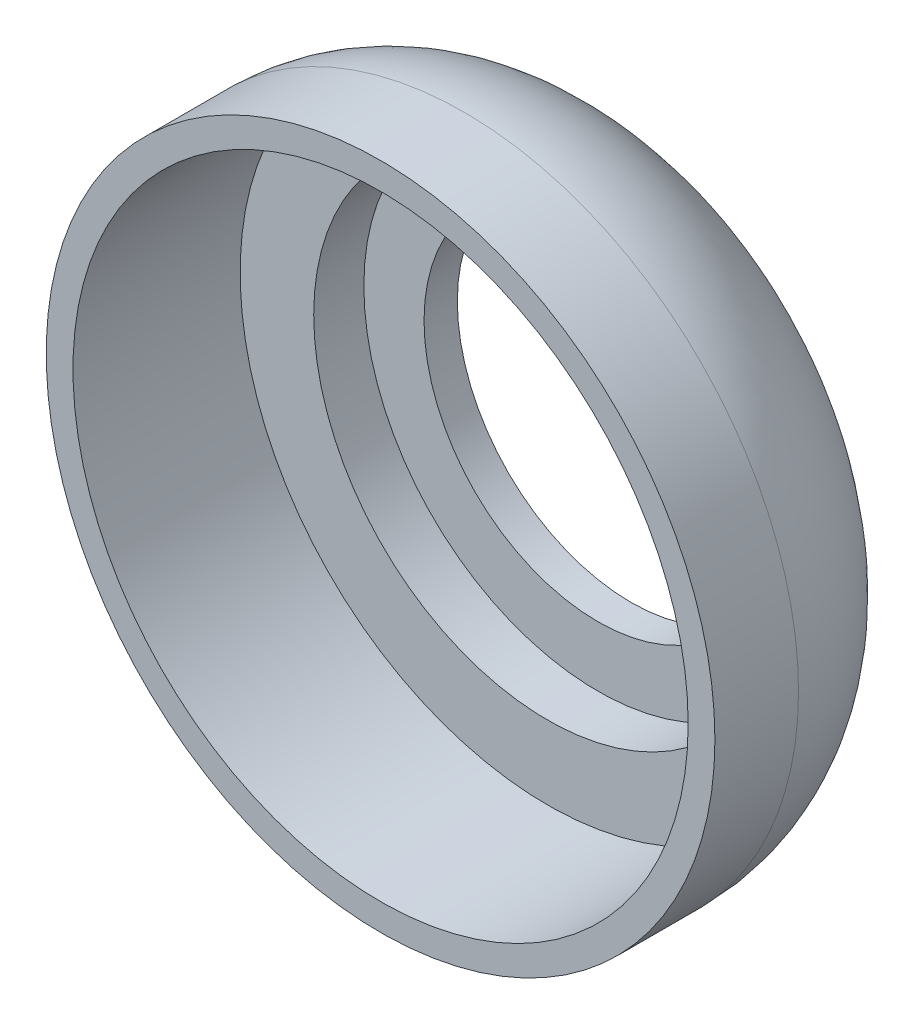
ISO-10303-21;
HEADER;
FILE_DESCRIPTION(('STEP AP214'),'2;1');
FILE_NAME('part.step','',(''),(''),'','','');
FILE_SCHEMA(('AUTOMOTIVE_DESIGN { 1 0 10303 214 1 1 1 1 }'));
ENDSEC;
DATA;
#1=APPLICATION_CONTEXT('core data for automotive mechanical design processes');
#2=APPLICATION_PROTOCOL_DEFINITION('international standard','automotive_design',2000,#1);
#3=PRODUCT_CONTEXT('',#1,'mechanical');
#4=PRODUCT('Part','Part','',(#3));
#5=PRODUCT_RELATED_PRODUCT_CATEGORY('part','',(#4));
#6=PRODUCT_DEFINITION_FORMATION('','',#4);
#7=PRODUCT_DEFINITION_CONTEXT('part definition',#1,'design');
#8=PRODUCT_DEFINITION('design','',#6,#7);
#9=PRODUCT_DEFINITION_SHAPE('','',#8);
#10=(LENGTH_UNIT() NAMED_UNIT(*) SI_UNIT(.MILLI.,.METRE.));
#11=(NAMED_UNIT(*) PLANE_ANGLE_UNIT() SI_UNIT($,.RADIAN.));
#12=(NAMED_UNIT(*) SI_UNIT($,.STERADIAN.) SOLID_ANGLE_UNIT());
#13=UNCERTAINTY_MEASURE_WITH_UNIT(LENGTH_MEASURE(1.E-05),#10,'distance_accuracy_value','');
#14=(GEOMETRIC_REPRESENTATION_CONTEXT(3) GLOBAL_UNCERTAINTY_ASSIGNED_CONTEXT((#13)) GLOBAL_UNIT_ASSIGNED_CONTEXT((#10,
#11,#12)) REPRESENTATION_CONTEXT('',''));
#15=CARTESIAN_POINT('',(0.,0.,0.));
#16=DIRECTION('',(0.,0.,1.));
#17=DIRECTION('',(1.,0.,0.));
#18=AXIS2_PLACEMENT_3D('',#15,#16,#17);
#19=CARTESIAN_POINT('',(0.,0.,2.));
#20=DIRECTION('',(0.,0.,1.));
#21=DIRECTION('',(1.,0.,0.));
#22=AXIS2_PLACEMENT_3D('',#19,#20,#21);
#23=CYLINDRICAL_SURFACE('',#22,14.);
#24=CARTESIAN_POINT('',(0.,0.,2.));
#25=DIRECTION('',(0.,0.,1.));
#26=DIRECTION('',(1.,0.,0.));
#27=AXIS2_PLACEMENT_3D('',#24,#25,#26);
#28=CIRCLE('',#27,14.);
#29=CARTESIAN_POINT('',(14.,0.,2.));
#30=VERTEX_POINT('',#29);
#31=EDGE_CURVE('E52',#30,#30,#28,.T.);
#32=CARTESIAN_POINT('',(0.,0.,5.));
#33=DIRECTION('',(0.,0.,1.));
#34=DIRECTION('',(1.,0.,0.));
#35=AXIS2_PLACEMENT_3D('',#32,#33,#34);
#36=CIRCLE('',#35,14.);
#37=CARTESIAN_POINT('',(14.,0.,5.));
#38=VERTEX_POINT('',#37);
#39=EDGE_CURVE('E41',#38,#38,#36,.F.);
#40=CARTESIAN_POINT('',(14.,0.,2.));
#41=CARTESIAN_POINT('',(14.,0.,2.03125));
#42=CARTESIAN_POINT('',(14.,0.,2.0625));
#43=CARTESIAN_POINT('',(14.,0.,2.125));
#44=CARTESIAN_POINT('',(14.,0.,2.15625));
#45=CARTESIAN_POINT('',(14.,0.,2.21875));
#46=CARTESIAN_POINT('',(14.,0.,2.25));
#47=CARTESIAN_POINT('',(14.,0.,2.3125));
#48=CARTESIAN_POINT('',(14.,0.,2.34375));
#49=CARTESIAN_POINT('',(14.,0.,2.40625));
#50=CARTESIAN_POINT('',(14.,0.,2.4375));
#51=CARTESIAN_POINT('',(14.,0.,2.5));
#52=CARTESIAN_POINT('',(14.,0.,2.53125));
#53=CARTESIAN_POINT('',(14.,0.,2.59375));
#54=CARTESIAN_POINT('',(14.,0.,2.625));
#55=CARTESIAN_POINT('',(14.,0.,2.6875));
#56=CARTESIAN_POINT('',(14.,0.,2.71875));
#57=CARTESIAN_POINT('',(14.,0.,2.78125));
#58=CARTESIAN_POINT('',(14.,0.,2.8125));
#59=CARTESIAN_POINT('',(14.,0.,2.875));
#60=CARTESIAN_POINT('',(14.,0.,2.90625));
#61=CARTESIAN_POINT('',(14.,0.,2.96875));
#62=CARTESIAN_POINT('',(14.,0.,3.));
#63=CARTESIAN_POINT('',(14.,0.,3.0625));
#64=CARTESIAN_POINT('',(14.,0.,3.09375));
#65=CARTESIAN_POINT('',(14.,0.,3.15625));
#66=CARTESIAN_POINT('',(14.,0.,3.1875));
#67=CARTESIAN_POINT('',(14.,0.,3.25));
#68=CARTESIAN_POINT('',(14.,0.,3.28125));
#69=CARTESIAN_POINT('',(14.,0.,3.34375));
#70=CARTESIAN_POINT('',(14.,0.,3.375));
#71=CARTESIAN_POINT('',(14.,0.,3.4375));
#72=CARTESIAN_POINT('',(14.,0.,3.46875));
#73=CARTESIAN_POINT('',(14.,0.,3.53125));
#74=CARTESIAN_POINT('',(14.,0.,3.5625));
#75=CARTESIAN_POINT('',(14.,0.,3.625));
#76=CARTESIAN_POINT('',(14.,0.,3.65625));
#77=CARTESIAN_POINT('',(14.,0.,3.71875));
#78=CARTESIAN_POINT('',(14.,0.,3.75));
#79=CARTESIAN_POINT('',(14.,0.,3.8125));
#80=CARTESIAN_POINT('',(14.,0.,3.84375));
#81=CARTESIAN_POINT('',(14.,0.,3.90625));
#82=CARTESIAN_POINT('',(14.,0.,3.9375));
#83=CARTESIAN_POINT('',(14.,0.,4.));
#84=CARTESIAN_POINT('',(14.,0.,4.03125));
#85=CARTESIAN_POINT('',(14.,0.,4.09375));
#86=CARTESIAN_POINT('',(14.,0.,4.125));
#87=CARTESIAN_POINT('',(14.,0.,4.1875));
#88=CARTESIAN_POINT('',(14.,0.,4.21875));
#89=CARTESIAN_POINT('',(14.,0.,4.28125));
#90=CARTESIAN_POINT('',(14.,0.,4.3125));
#91=CARTESIAN_POINT('',(14.,0.,4.375));
#92=CARTESIAN_POINT('',(14.,0.,4.40625));
#93=CARTESIAN_POINT('',(14.,0.,4.46875));
#94=CARTESIAN_POINT('',(14.,0.,4.5));
#95=CARTESIAN_POINT('',(14.,0.,4.5625));
#96=CARTESIAN_POINT('',(14.,0.,4.59375));
#97=CARTESIAN_POINT('',(14.,0.,4.65625));
#98=CARTESIAN_POINT('',(14.,0.,4.6875));
#99=CARTESIAN_POINT('',(14.,0.,4.75));
#100=CARTESIAN_POINT('',(14.,0.,4.78125));
#101=CARTESIAN_POINT('',(14.,0.,4.84375));
#102=CARTESIAN_POINT('',(14.,0.,4.875));
#103=CARTESIAN_POINT('',(14.,0.,4.9375));
#104=CARTESIAN_POINT('',(14.,0.,4.96875));
#105=CARTESIAN_POINT('',(14.,0.,5.));
#106=B_SPLINE_CURVE_WITH_KNOTS('',3,(#40,#41,#42,#43,#44,#45,#46,#47,#48,#49,#50,#51,#52,#53,
#54,#55,#56,#57,#58,#59,#60,#61,#62,#63,#64,#65,#66,#67,#68,#69,#70,#71,#72,#73,#74,#75,#76,#77,
#78,#79,#80,#81,#82,#83,#84,#85,#86,#87,#88,#89,#90,#91,#92,#93,#94,#95,#96,#97,#98,#99,#100,
#101,#102,#103,#104,#105),.UNSPECIFIED.,.F.,.F.,(4,2,2,2,2,2,2,2,2,2,2,2,2,2,2,2,2,2,2,2,2,2,2,
2,2,2,2,2,2,2,2,2,4),(0.,0.0937500000000001,0.1875,0.28125,0.375,0.46875,0.5625,0.65625,0.75,
0.84375,0.9375,1.03125,1.125,1.21875,1.3125,1.40625,1.5,1.59375,1.6875,1.78125,1.875,1.96875,
2.0625,2.15625,2.25,2.34375,2.4375,2.53125,2.625,2.71875,2.8125,2.90625,3.),.UNSPECIFIED.);
#107=EDGE_CURVE('BSEAM37',#30,#38,#106,.T.);
#108=ORIENTED_EDGE('',*,*,#31,.F.);
#109=ORIENTED_EDGE('',*,*,#39,.F.);
#110=ORIENTED_EDGE('',*,*,#107,.T.);
#111=ORIENTED_EDGE('',*,*,#107,.F.);
#112=EDGE_LOOP('',(#108,#110,#109,#111));
#113=FACE_BOUND('',#112,.T.);
#114=ADVANCED_FACE('F37',(#113),#23,.F.);
#115=CARTESIAN_POINT('',(0.,0.,15.));
#116=DIRECTION('',(0.,0.,-1.));
#117=DIRECTION('',(-1.,0.,0.));
#118=AXIS2_PLACEMENT_3D('',#115,#116,#117);
#119=CYLINDRICAL_SURFACE('',#118,20.);
#120=CARTESIAN_POINT('',(0.,0.,10.));
#121=DIRECTION('',(0.,0.,1.));
#122=DIRECTION('',(1.,0.,0.));
#123=AXIS2_PLACEMENT_3D('',#120,#121,#122);
#124=CIRCLE('',#123,20.);
#125=CARTESIAN_POINT('',(20.,0.,10.));
#126=VERTEX_POINT('',#125);
#127=EDGE_CURVE('E10',#126,#126,#124,.T.);
#128=ORIENTED_EDGE('',*,*,#127,.T.);
#129=EDGE_LOOP('',(#128));
#130=FACE_BOUND('',#129,.T.);
#131=CARTESIAN_POINT('',(0.,0.,15.));
#132=DIRECTION('',(0.,0.,1.));
#133=DIRECTION('',(1.,0.,0.));
#134=AXIS2_PLACEMENT_3D('',#131,#132,#133);
#135=CIRCLE('',#134,20.);
#136=CARTESIAN_POINT('',(20.,0.,15.));
#137=VERTEX_POINT('',#136);
#138=EDGE_CURVE('E46',#137,#137,#135,.T.);
#139=ORIENTED_EDGE('',*,*,#138,.F.);
#140=EDGE_LOOP('',(#139));
#141=FACE_BOUND('',#140,.T.);
#142=ADVANCED_FACE('F86',(#130,#141),#119,.T.);
#143=CARTESIAN_POINT('',(0.,0.,15.));
#144=DIRECTION('',(0.,0.,1.));
#145=DIRECTION('',(1.,0.,0.));
#146=AXIS2_PLACEMENT_3D('',#143,#144,#145);
#147=PLANE('',#146);
#148=CARTESIAN_POINT('',(0.,0.,15.));
#149=DIRECTION('',(0.,0.,1.));
#150=DIRECTION('',(1.,0.,0.));
#151=AXIS2_PLACEMENT_3D('',#148,#149,#150);
#152=CIRCLE('',#151,18.4);
#153=CARTESIAN_POINT('',(18.4,0.,15.));
#154=VERTEX_POINT('',#153);
#155=EDGE_CURVE('E71',#154,#154,#152,.T.);
#156=ORIENTED_EDGE('',*,*,#155,.F.);
#157=EDGE_LOOP('',(#156));
#158=FACE_BOUND('',#157,.T.);
#159=ORIENTED_EDGE('',*,*,#138,.T.);
#160=EDGE_LOOP('',(#159));
#161=FACE_BOUND('',#160,.T.);
#162=ADVANCED_FACE('F91',(#158,#161),#147,.T.);
#163=CARTESIAN_POINT('',(0.,0.,10.));
#164=DIRECTION('',(0.,0.,1.));
#165=DIRECTION('',(1.,0.,0.));
#166=AXIS2_PLACEMENT_3D('',#163,#164,#165);
#167=DEGENERATE_TOROIDAL_SURFACE('',#166,10.,10.,.T.);
#168=CARTESIAN_POINT('',(0.,0.,0.00800320256256343));
#169=DIRECTION('',(0.,0.,1.));
#170=DIRECTION('',(1.,0.,0.));
#171=AXIS2_PLACEMENT_3D('',#168,#169,#170);
#172=CIRCLE('',#171,10.4);
#173=CARTESIAN_POINT('',(10.4,0.,0.00800320256256343));
#174=VERTEX_POINT('',#173);
#175=EDGE_CURVE('E58',#174,#174,#172,.F.);
#176=ORIENTED_EDGE('',*,*,#175,.F.);
#177=EDGE_LOOP('',(#176));
#178=FACE_BOUND('',#177,.T.);
#179=ORIENTED_EDGE('',*,*,#127,.F.);
#180=EDGE_LOOP('',(#179));
#181=FACE_BOUND('',#180,.T.);
#182=ADVANCED_FACE('F39',(#178,#181),#167,.T.);
#183=CARTESIAN_POINT('',(0.,0.,2.));
#184=DIRECTION('',(0.,0.,1.));
#185=DIRECTION('',(1.,0.,0.));
#186=AXIS2_PLACEMENT_3D('',#183,#184,#185);
#187=PLANE('',#186);
#188=CARTESIAN_POINT('',(0.,0.,2.));
#189=DIRECTION('',(0.,0.,1.));
#190=DIRECTION('',(1.,0.,0.));
#191=AXIS2_PLACEMENT_3D('',#188,#189,#190);
#192=CIRCLE('',#191,10.4);
#193=CARTESIAN_POINT('',(10.4,0.,2.));
#194=VERTEX_POINT('',#193);
#195=EDGE_CURVE('E55',#194,#194,#192,.T.);
#196=ORIENTED_EDGE('',*,*,#195,.F.);
#197=EDGE_LOOP('',(#196));
#198=FACE_BOUND('',#197,.T.);
#199=ORIENTED_EDGE('',*,*,#31,.T.);
#200=EDGE_LOOP('',(#199));
#201=FACE_BOUND('',#200,.T.);
#202=ADVANCED_FACE('F82',(#198,#201),#187,.T.);
#203=CARTESIAN_POINT('',(0.,0.,11.));
#204=DIRECTION('',(0.,0.,-1.));
#205=DIRECTION('',(-1.,0.,0.));
#206=AXIS2_PLACEMENT_3D('',#203,#204,#205);
#207=CYLINDRICAL_SURFACE('',#206,10.4);
#208=ORIENTED_EDGE('',*,*,#175,.T.);
#209=EDGE_LOOP('',(#208));
#210=FACE_BOUND('',#209,.T.);
#211=ORIENTED_EDGE('',*,*,#195,.T.);
#212=EDGE_LOOP('',(#211));
#213=FACE_BOUND('',#212,.T.);
#214=ADVANCED_FACE('F114',(#210,#213),#207,.F.);
#215=CARTESIAN_POINT('',(0.,0.,5.));
#216=DIRECTION('',(0.,0.,1.));
#217=DIRECTION('',(1.,0.,0.));
#218=AXIS2_PLACEMENT_3D('',#215,#216,#217);
#219=PLANE('',#218);
#220=CARTESIAN_POINT('',(0.,0.,5.));
#221=DIRECTION('',(0.,0.,1.));
#222=DIRECTION('',(1.,0.,0.));
#223=AXIS2_PLACEMENT_3D('',#220,#221,#222);
#224=CIRCLE('',#223,18.4);
#225=CARTESIAN_POINT('',(18.4,0.,5.));
#226=VERTEX_POINT('',#225);
#227=EDGE_CURVE('E66',#226,#226,#224,.T.);
#228=ORIENTED_EDGE('',*,*,#227,.T.);
#229=EDGE_LOOP('',(#228));
#230=FACE_BOUND('',#229,.T.);
#231=ORIENTED_EDGE('',*,*,#39,.T.);
#232=EDGE_LOOP('',(#231));
#233=FACE_BOUND('',#232,.T.);
#234=ADVANCED_FACE('F108',(#230,#233),#219,.T.);
#235=CARTESIAN_POINT('',(0.,0.,5.));
#236=DIRECTION('',(0.,0.,1.));
#237=DIRECTION('',(1.,0.,0.));
#238=AXIS2_PLACEMENT_3D('',#235,#236,#237);
#239=CYLINDRICAL_SURFACE('',#238,18.4);
#240=ORIENTED_EDGE('',*,*,#227,.F.);
#241=EDGE_LOOP('',(#240));
#242=FACE_BOUND('',#241,.T.);
#243=ORIENTED_EDGE('',*,*,#155,.T.);
#244=EDGE_LOOP('',(#243));
#245=FACE_BOUND('',#244,.T.);
#246=ADVANCED_FACE('F106',(#242,#245),#239,.F.);
#247=CLOSED_SHELL('',(#114,#142,#162,#182,#202,#214,#234,#246));
#248=MANIFOLD_SOLID_BREP('B2',#247);
#249=ADVANCED_BREP_SHAPE_REPRESENTATION('',(#18,#248),#14);
#250=SHAPE_DEFINITION_REPRESENTATION(#9,#249);
ENDSEC;
END-ISO-10303-21;
